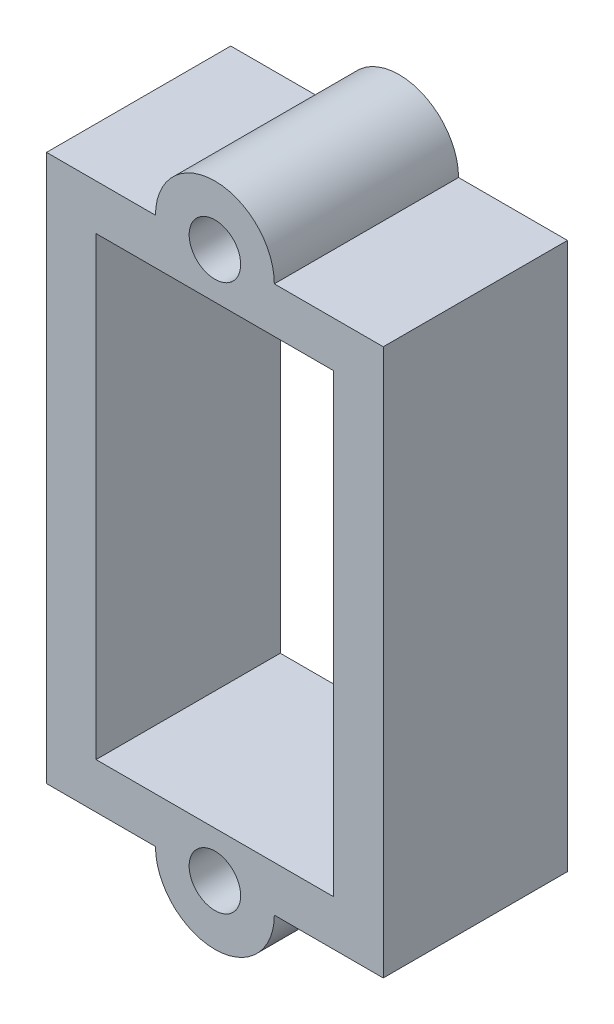
ISO-10303-21;
HEADER;
FILE_DESCRIPTION(('STEP AP214'),'2;1');
FILE_NAME('part.step','',(''),(''),'','','');
FILE_SCHEMA(('AUTOMOTIVE_DESIGN { 1 0 10303 214 1 1 1 1 }'));
ENDSEC;
DATA;
#1=APPLICATION_CONTEXT('core data for automotive mechanical design processes');
#2=APPLICATION_PROTOCOL_DEFINITION('international standard','automotive_design',2000,#1);
#3=PRODUCT_CONTEXT('',#1,'mechanical');
#4=PRODUCT('Part','Part','',(#3));
#5=PRODUCT_RELATED_PRODUCT_CATEGORY('part','',(#4));
#6=PRODUCT_DEFINITION_FORMATION('','',#4);
#7=PRODUCT_DEFINITION_CONTEXT('part definition',#1,'design');
#8=PRODUCT_DEFINITION('design','',#6,#7);
#9=PRODUCT_DEFINITION_SHAPE('','',#8);
#10=(LENGTH_UNIT() NAMED_UNIT(*) SI_UNIT(.MILLI.,.METRE.));
#11=(NAMED_UNIT(*) PLANE_ANGLE_UNIT() SI_UNIT($,.RADIAN.));
#12=(NAMED_UNIT(*) SI_UNIT($,.STERADIAN.) SOLID_ANGLE_UNIT());
#13=UNCERTAINTY_MEASURE_WITH_UNIT(LENGTH_MEASURE(1.E-05),#10,'distance_accuracy_value','');
#14=(GEOMETRIC_REPRESENTATION_CONTEXT(3) GLOBAL_UNCERTAINTY_ASSIGNED_CONTEXT((#13)) GLOBAL_UNIT_ASSIGNED_CONTEXT((#10,
#11,#12)) REPRESENTATION_CONTEXT('',''));
#15=CARTESIAN_POINT('',(0.,0.,0.));
#16=DIRECTION('',(0.,0.,1.));
#17=DIRECTION('',(1.,0.,0.));
#18=AXIS2_PLACEMENT_3D('',#15,#16,#17);
#19=CARTESIAN_POINT('',(0.,-13.8,9.3));
#20=DIRECTION('',(0.,0.,1.));
#21=DIRECTION('',(1.,0.,0.));
#22=AXIS2_PLACEMENT_3D('',#19,#20,#21);
#23=PLANE('',#22);
#24=CARTESIAN_POINT('',(0.,13.8,9.3));
#25=DIRECTION('',(0.,0.,1.));
#26=DIRECTION('',(1.,0.,0.));
#27=AXIS2_PLACEMENT_3D('',#24,#25,#26);
#28=CIRCLE('',#27,1.3);
#29=CARTESIAN_POINT('',(1.3,13.8,9.3));
#30=VERTEX_POINT('',#29);
#31=EDGE_CURVE('E170',#30,#30,#28,.T.);
#32=ORIENTED_EDGE('',*,*,#31,.F.);
#33=EDGE_LOOP('',(#32));
#34=FACE_BOUND('',#33,.T.);
#35=CARTESIAN_POINT('',(0.,-13.8,9.3));
#36=DIRECTION('',(0.,0.,1.));
#37=DIRECTION('',(1.,0.,0.));
#38=AXIS2_PLACEMENT_3D('',#35,#36,#37);
#39=CIRCLE('',#38,2.99999999999999);
#40=CARTESIAN_POINT('',(-2.99999999999999,-13.8,9.3));
#41=VERTEX_POINT('',#40);
#42=CARTESIAN_POINT('',(2.99999999999999,-13.8,9.3));
#43=VERTEX_POINT('',#42);
#44=EDGE_CURVE('E186',#41,#43,#39,.T.);
#45=ORIENTED_EDGE('',*,*,#44,.T.);
#46=DIRECTION('',(1.,0.,0.));
#47=VECTOR('',#46,1.);
#48=CARTESIAN_POINT('',(8.50000000000001,-13.8,9.3));
#49=LINE('',#48,#47);
#50=CARTESIAN_POINT('',(8.50000000000001,-13.8,9.3));
#51=VERTEX_POINT('',#50);
#52=EDGE_CURVE('E190',#43,#51,#49,.T.);
#53=ORIENTED_EDGE('',*,*,#52,.T.);
#54=DIRECTION('',(0.,1.,0.));
#55=VECTOR('',#54,1.);
#56=CARTESIAN_POINT('',(8.5,13.8,9.3));
#57=LINE('',#56,#55);
#58=CARTESIAN_POINT('',(8.5,13.8,9.3));
#59=VERTEX_POINT('',#58);
#60=EDGE_CURVE('E194',#51,#59,#57,.T.);
#61=ORIENTED_EDGE('',*,*,#60,.T.);
#62=DIRECTION('',(-1.,0.,0.));
#63=VECTOR('',#62,1.);
#64=CARTESIAN_POINT('',(2.99999999999999,13.8,9.3));
#65=LINE('',#64,#63);
#66=CARTESIAN_POINT('',(2.99999999999999,13.8,9.3));
#67=VERTEX_POINT('',#66);
#68=EDGE_CURVE('E197',#59,#67,#65,.T.);
#69=ORIENTED_EDGE('',*,*,#68,.T.);
#70=CARTESIAN_POINT('',(0.,13.8,9.3));
#71=DIRECTION('',(0.,0.,1.));
#72=DIRECTION('',(-1.,0.,0.));
#73=AXIS2_PLACEMENT_3D('',#70,#71,#72);
#74=CIRCLE('',#73,2.99999999999999);
#75=CARTESIAN_POINT('',(-2.99999999999999,13.8,9.3));
#76=VERTEX_POINT('',#75);
#77=EDGE_CURVE('E200',#67,#76,#74,.T.);
#78=ORIENTED_EDGE('',*,*,#77,.T.);
#79=DIRECTION('',(-1.,0.,0.));
#80=VECTOR('',#79,1.);
#81=CARTESIAN_POINT('',(-2.99999999999999,13.8,9.3));
#82=LINE('',#81,#80);
#83=CARTESIAN_POINT('',(-8.50000000000001,13.8,9.3));
#84=VERTEX_POINT('',#83);
#85=EDGE_CURVE('E203',#76,#84,#82,.T.);
#86=ORIENTED_EDGE('',*,*,#85,.T.);
#87=DIRECTION('',(0.,-1.,0.));
#88=VECTOR('',#87,1.);
#89=CARTESIAN_POINT('',(-8.50000000000001,13.8,9.3));
#90=LINE('',#89,#88);
#91=CARTESIAN_POINT('',(-8.5,-13.8,9.3));
#92=VERTEX_POINT('',#91);
#93=EDGE_CURVE('E206',#84,#92,#90,.T.);
#94=ORIENTED_EDGE('',*,*,#93,.T.);
#95=DIRECTION('',(1.,0.,0.));
#96=VECTOR('',#95,1.);
#97=CARTESIAN_POINT('',(-8.5,-13.8,9.3));
#98=LINE('',#97,#96);
#99=EDGE_CURVE('E209',#92,#41,#98,.T.);
#100=ORIENTED_EDGE('',*,*,#99,.T.);
#101=EDGE_LOOP('',(#45,#53,#61,#69,#78,#86,#94,#100));
#102=FACE_BOUND('',#101,.T.);
#103=DIRECTION('',(-1.,0.,0.));
#104=VECTOR('',#103,1.);
#105=CARTESIAN_POINT('',(-6.,11.5,9.3));
#106=LINE('',#105,#104);
#107=CARTESIAN_POINT('',(6.,11.5,9.3));
#108=VERTEX_POINT('',#107);
#109=CARTESIAN_POINT('',(-6.,11.5,9.3));
#110=VERTEX_POINT('',#109);
#111=EDGE_CURVE('E144',#108,#110,#106,.T.);
#112=ORIENTED_EDGE('',*,*,#111,.F.);
#113=DIRECTION('',(0.,1.,0.));
#114=VECTOR('',#113,1.);
#115=CARTESIAN_POINT('',(6.,11.5,9.3));
#116=LINE('',#115,#114);
#117=CARTESIAN_POINT('',(6.,-11.5,9.3));
#118=VERTEX_POINT('',#117);
#119=EDGE_CURVE('E135',#118,#108,#116,.T.);
#120=ORIENTED_EDGE('',*,*,#119,.F.);
#121=DIRECTION('',(1.,0.,0.));
#122=VECTOR('',#121,1.);
#123=CARTESIAN_POINT('',(-5.99999999999999,-11.5,9.3));
#124=LINE('',#123,#122);
#125=CARTESIAN_POINT('',(-5.99999999999999,-11.5,9.3));
#126=VERTEX_POINT('',#125);
#127=EDGE_CURVE('E162',#126,#118,#124,.T.);
#128=ORIENTED_EDGE('',*,*,#127,.F.);
#129=DIRECTION('',(0.,-1.,0.));
#130=VECTOR('',#129,1.);
#131=CARTESIAN_POINT('',(-6.,11.5,9.3));
#132=LINE('',#131,#130);
#133=EDGE_CURVE('E158',#110,#126,#132,.T.);
#134=ORIENTED_EDGE('',*,*,#133,.F.);
#135=EDGE_LOOP('',(#112,#120,#128,#134));
#136=FACE_BOUND('',#135,.T.);
#137=CARTESIAN_POINT('',(0.,-13.8,9.3));
#138=DIRECTION('',(0.,0.,1.));
#139=DIRECTION('',(1.,0.,0.));
#140=AXIS2_PLACEMENT_3D('',#137,#138,#139);
#141=CIRCLE('',#140,1.3);
#142=CARTESIAN_POINT('',(1.30000000000001,-13.8,9.3));
#143=VERTEX_POINT('',#142);
#144=EDGE_CURVE('E349',#143,#143,#141,.T.);
#145=ORIENTED_EDGE('',*,*,#144,.F.);
#146=EDGE_LOOP('',(#145));
#147=FACE_BOUND('',#146,.T.);
#148=ADVANCED_FACE('F45',(#34,#102,#136,#147),#23,.T.);
#149=CARTESIAN_POINT('',(0.,-13.8,0.));
#150=DIRECTION('',(0.,0.,1.));
#151=DIRECTION('',(1.,0.,0.));
#152=AXIS2_PLACEMENT_3D('',#149,#150,#151);
#153=PLANE('',#152);
#154=CARTESIAN_POINT('',(0.,-13.8,0.));
#155=DIRECTION('',(0.,0.,1.));
#156=DIRECTION('',(1.,0.,0.));
#157=AXIS2_PLACEMENT_3D('',#154,#155,#156);
#158=CIRCLE('',#157,2.99999999999999);
#159=CARTESIAN_POINT('',(-2.99999999999999,-13.8,0.));
#160=VERTEX_POINT('',#159);
#161=CARTESIAN_POINT('',(2.99999999999999,-13.8,0.));
#162=VERTEX_POINT('',#161);
#163=EDGE_CURVE('E153',#160,#162,#158,.T.);
#164=ORIENTED_EDGE('',*,*,#163,.F.);
#165=DIRECTION('',(1.,0.,0.));
#166=VECTOR('',#165,1.);
#167=CARTESIAN_POINT('',(-8.5,-13.8,0.));
#168=LINE('',#167,#166);
#169=CARTESIAN_POINT('',(-8.5,-13.8,0.));
#170=VERTEX_POINT('',#169);
#171=EDGE_CURVE('E191',#170,#160,#168,.T.);
#172=ORIENTED_EDGE('',*,*,#171,.F.);
#173=DIRECTION('',(0.,-1.,0.));
#174=VECTOR('',#173,1.);
#175=CARTESIAN_POINT('',(-8.50000000000001,13.8,0.));
#176=LINE('',#175,#174);
#177=CARTESIAN_POINT('',(-8.50000000000001,13.8,0.));
#178=VERTEX_POINT('',#177);
#179=EDGE_CURVE('E231',#178,#170,#176,.T.);
#180=ORIENTED_EDGE('',*,*,#179,.F.);
#181=DIRECTION('',(-1.,0.,0.));
#182=VECTOR('',#181,1.);
#183=CARTESIAN_POINT('',(-2.99999999999999,13.8,0.));
#184=LINE('',#183,#182);
#185=CARTESIAN_POINT('',(-2.99999999999999,13.8,0.));
#186=VERTEX_POINT('',#185);
#187=EDGE_CURVE('E228',#186,#178,#184,.T.);
#188=ORIENTED_EDGE('',*,*,#187,.F.);
#189=CARTESIAN_POINT('',(0.,13.8,0.));
#190=DIRECTION('',(0.,0.,1.));
#191=DIRECTION('',(-1.,0.,0.));
#192=AXIS2_PLACEMENT_3D('',#189,#190,#191);
#193=CIRCLE('',#192,2.99999999999999);
#194=CARTESIAN_POINT('',(2.99999999999999,13.8,0.));
#195=VERTEX_POINT('',#194);
#196=EDGE_CURVE('E225',#195,#186,#193,.T.);
#197=ORIENTED_EDGE('',*,*,#196,.F.);
#198=DIRECTION('',(-1.,0.,0.));
#199=VECTOR('',#198,1.);
#200=CARTESIAN_POINT('',(2.99999999999999,13.8,0.));
#201=LINE('',#200,#199);
#202=CARTESIAN_POINT('',(8.5,13.8,0.));
#203=VERTEX_POINT('',#202);
#204=EDGE_CURVE('E222',#203,#195,#201,.T.);
#205=ORIENTED_EDGE('',*,*,#204,.F.);
#206=DIRECTION('',(0.,1.,0.));
#207=VECTOR('',#206,1.);
#208=CARTESIAN_POINT('',(8.5,13.8,0.));
#209=LINE('',#208,#207);
#210=CARTESIAN_POINT('',(8.50000000000001,-13.8,0.));
#211=VERTEX_POINT('',#210);
#212=EDGE_CURVE('E219',#211,#203,#209,.T.);
#213=ORIENTED_EDGE('',*,*,#212,.F.);
#214=DIRECTION('',(1.,0.,0.));
#215=VECTOR('',#214,1.);
#216=CARTESIAN_POINT('',(8.50000000000001,-13.8,0.));
#217=LINE('',#216,#215);
#218=EDGE_CURVE('E216',#162,#211,#217,.T.);
#219=ORIENTED_EDGE('',*,*,#218,.F.);
#220=EDGE_LOOP('',(#164,#172,#180,#188,#197,#205,#213,#219));
#221=FACE_BOUND('',#220,.T.);
#222=DIRECTION('',(0.,1.,0.));
#223=VECTOR('',#222,1.);
#224=CARTESIAN_POINT('',(6.,11.5,0.));
#225=LINE('',#224,#223);
#226=CARTESIAN_POINT('',(6.,-11.5,0.));
#227=VERTEX_POINT('',#226);
#228=CARTESIAN_POINT('',(6.,11.5,0.));
#229=VERTEX_POINT('',#228);
#230=EDGE_CURVE('E69',#227,#229,#225,.T.);
#231=ORIENTED_EDGE('',*,*,#230,.T.);
#232=DIRECTION('',(-1.,0.,0.));
#233=VECTOR('',#232,1.);
#234=CARTESIAN_POINT('',(-6.,11.5,0.));
#235=LINE('',#234,#233);
#236=CARTESIAN_POINT('',(-6.,11.5,0.));
#237=VERTEX_POINT('',#236);
#238=EDGE_CURVE('E151',#229,#237,#235,.T.);
#239=ORIENTED_EDGE('',*,*,#238,.T.);
#240=DIRECTION('',(0.,-1.,0.));
#241=VECTOR('',#240,1.);
#242=CARTESIAN_POINT('',(-6.,11.5,0.));
#243=LINE('',#242,#241);
#244=CARTESIAN_POINT('',(-5.99999999999999,-11.5,0.));
#245=VERTEX_POINT('',#244);
#246=EDGE_CURVE('E173',#237,#245,#243,.T.);
#247=ORIENTED_EDGE('',*,*,#246,.T.);
#248=DIRECTION('',(1.,0.,0.));
#249=VECTOR('',#248,1.);
#250=CARTESIAN_POINT('',(-5.99999999999999,-11.5,0.));
#251=LINE('',#250,#249);
#252=EDGE_CURVE('E145',#245,#227,#251,.T.);
#253=ORIENTED_EDGE('',*,*,#252,.T.);
#254=EDGE_LOOP('',(#231,#239,#247,#253));
#255=FACE_BOUND('',#254,.T.);
#256=CARTESIAN_POINT('',(0.,13.8,0.));
#257=DIRECTION('',(0.,0.,1.));
#258=DIRECTION('',(1.,0.,0.));
#259=AXIS2_PLACEMENT_3D('',#256,#257,#258);
#260=CIRCLE('',#259,1.3);
#261=CARTESIAN_POINT('',(1.3,13.8,0.));
#262=VERTEX_POINT('',#261);
#263=EDGE_CURVE('E357',#262,#262,#260,.T.);
#264=ORIENTED_EDGE('',*,*,#263,.T.);
#265=EDGE_LOOP('',(#264));
#266=FACE_BOUND('',#265,.T.);
#267=CARTESIAN_POINT('',(0.,-13.8,0.));
#268=DIRECTION('',(0.,0.,1.));
#269=DIRECTION('',(1.,0.,0.));
#270=AXIS2_PLACEMENT_3D('',#267,#268,#269);
#271=CIRCLE('',#270,1.3);
#272=CARTESIAN_POINT('',(1.30000000000001,-13.8,0.));
#273=VERTEX_POINT('',#272);
#274=EDGE_CURVE('E352',#273,#273,#271,.T.);
#275=ORIENTED_EDGE('',*,*,#274,.T.);
#276=EDGE_LOOP('',(#275));
#277=FACE_BOUND('',#276,.T.);
#278=ADVANCED_FACE('F270',(#221,#255,#266,#277),#153,.F.);
#279=CARTESIAN_POINT('',(0.,-13.8,9.3));
#280=DIRECTION('',(0.,0.,-1.));
#281=DIRECTION('',(-1.,0.,0.));
#282=AXIS2_PLACEMENT_3D('',#279,#280,#281);
#283=CYLINDRICAL_SURFACE('',#282,2.99999999999999);
#284=ORIENTED_EDGE('',*,*,#163,.T.);
#285=DIRECTION('',(0.,0.,-1.));
#286=VECTOR('',#285,1.);
#287=CARTESIAN_POINT('',(2.99999999999999,-13.8,9.3));
#288=LINE('',#287,#286);
#289=EDGE_CURVE('E11',#43,#162,#288,.T.);
#290=ORIENTED_EDGE('',*,*,#289,.F.);
#291=ORIENTED_EDGE('',*,*,#44,.F.);
#292=DIRECTION('',(0.,0.,-1.));
#293=VECTOR('',#292,1.);
#294=CARTESIAN_POINT('',(-2.99999999999999,-13.8,9.3));
#295=LINE('',#294,#293);
#296=EDGE_CURVE('E212',#41,#160,#295,.T.);
#297=ORIENTED_EDGE('',*,*,#296,.T.);
#298=EDGE_LOOP('',(#284,#290,#291,#297));
#299=FACE_BOUND('',#298,.T.);
#300=ADVANCED_FACE('F47',(#299),#283,.T.);
#301=CARTESIAN_POINT('',(8.50000000000001,-13.8,9.3));
#302=DIRECTION('',(0.,1.,0.));
#303=DIRECTION('',(-1.,0.,0.));
#304=AXIS2_PLACEMENT_3D('',#301,#302,#303);
#305=PLANE('',#304);
#306=ORIENTED_EDGE('',*,*,#218,.T.);
#307=DIRECTION('',(0.,0.,-1.));
#308=VECTOR('',#307,1.);
#309=CARTESIAN_POINT('',(8.50000000000001,-13.8,9.3));
#310=LINE('',#309,#308);
#311=EDGE_CURVE('E54',#51,#211,#310,.T.);
#312=ORIENTED_EDGE('',*,*,#311,.F.);
#313=ORIENTED_EDGE('',*,*,#52,.F.);
#314=ORIENTED_EDGE('',*,*,#289,.T.);
#315=EDGE_LOOP('',(#306,#312,#313,#314));
#316=FACE_BOUND('',#315,.T.);
#317=ADVANCED_FACE('F287',(#316),#305,.F.);
#318=CARTESIAN_POINT('',(8.5,13.8,9.3));
#319=DIRECTION('',(-1.,0.,0.));
#320=DIRECTION('',(0.,-1.,0.));
#321=AXIS2_PLACEMENT_3D('',#318,#319,#320);
#322=PLANE('',#321);
#323=ORIENTED_EDGE('',*,*,#212,.T.);
#324=DIRECTION('',(0.,0.,-1.));
#325=VECTOR('',#324,1.);
#326=CARTESIAN_POINT('',(8.5,13.8,9.3));
#327=LINE('',#326,#325);
#328=EDGE_CURVE('E255',#59,#203,#327,.T.);
#329=ORIENTED_EDGE('',*,*,#328,.F.);
#330=ORIENTED_EDGE('',*,*,#60,.F.);
#331=ORIENTED_EDGE('',*,*,#311,.T.);
#332=EDGE_LOOP('',(#323,#329,#330,#331));
#333=FACE_BOUND('',#332,.T.);
#334=ADVANCED_FACE('F264',(#333),#322,.F.);
#335=CARTESIAN_POINT('',(2.99999999999999,13.8,9.3));
#336=DIRECTION('',(0.,-1.,0.));
#337=DIRECTION('',(0.,0.,-1.));
#338=AXIS2_PLACEMENT_3D('',#335,#336,#337);
#339=PLANE('',#338);
#340=ORIENTED_EDGE('',*,*,#204,.T.);
#341=DIRECTION('',(0.,0.,-1.));
#342=VECTOR('',#341,1.);
#343=CARTESIAN_POINT('',(2.99999999999999,13.8,9.3));
#344=LINE('',#343,#342);
#345=EDGE_CURVE('E251',#67,#195,#344,.T.);
#346=ORIENTED_EDGE('',*,*,#345,.F.);
#347=ORIENTED_EDGE('',*,*,#68,.F.);
#348=ORIENTED_EDGE('',*,*,#328,.T.);
#349=EDGE_LOOP('',(#340,#346,#347,#348));
#350=FACE_BOUND('',#349,.T.);
#351=ADVANCED_FACE('F276',(#350),#339,.F.);
#352=CARTESIAN_POINT('',(0.,13.8,9.3));
#353=DIRECTION('',(0.,0.,-1.));
#354=DIRECTION('',(-1.,0.,0.));
#355=AXIS2_PLACEMENT_3D('',#352,#353,#354);
#356=CYLINDRICAL_SURFACE('',#355,2.99999999999999);
#357=ORIENTED_EDGE('',*,*,#196,.T.);
#358=DIRECTION('',(0.,0.,-1.));
#359=VECTOR('',#358,1.);
#360=CARTESIAN_POINT('',(-2.99999999999999,13.8,9.3));
#361=LINE('',#360,#359);
#362=EDGE_CURVE('E247',#76,#186,#361,.T.);
#363=ORIENTED_EDGE('',*,*,#362,.F.);
#364=ORIENTED_EDGE('',*,*,#77,.F.);
#365=ORIENTED_EDGE('',*,*,#345,.T.);
#366=EDGE_LOOP('',(#357,#363,#364,#365));
#367=FACE_BOUND('',#366,.T.);
#368=ADVANCED_FACE('F280',(#367),#356,.T.);
#369=CARTESIAN_POINT('',(-2.99999999999999,13.8,9.3));
#370=DIRECTION('',(0.,-1.,0.));
#371=DIRECTION('',(1.,0.,0.));
#372=AXIS2_PLACEMENT_3D('',#369,#370,#371);
#373=PLANE('',#372);
#374=ORIENTED_EDGE('',*,*,#187,.T.);
#375=DIRECTION('',(0.,0.,-1.));
#376=VECTOR('',#375,1.);
#377=CARTESIAN_POINT('',(-8.50000000000001,13.8,9.3));
#378=LINE('',#377,#376);
#379=EDGE_CURVE('E243',#84,#178,#378,.T.);
#380=ORIENTED_EDGE('',*,*,#379,.F.);
#381=ORIENTED_EDGE('',*,*,#85,.F.);
#382=ORIENTED_EDGE('',*,*,#362,.T.);
#383=EDGE_LOOP('',(#374,#380,#381,#382));
#384=FACE_BOUND('',#383,.T.);
#385=ADVANCED_FACE('F300',(#384),#373,.F.);
#386=CARTESIAN_POINT('',(-8.50000000000001,13.8,9.3));
#387=DIRECTION('',(1.,0.,0.));
#388=DIRECTION('',(0.,1.,0.));
#389=AXIS2_PLACEMENT_3D('',#386,#387,#388);
#390=PLANE('',#389);
#391=ORIENTED_EDGE('',*,*,#179,.T.);
#392=DIRECTION('',(0.,0.,-1.));
#393=VECTOR('',#392,1.);
#394=CARTESIAN_POINT('',(-8.5,-13.8,9.3));
#395=LINE('',#394,#393);
#396=EDGE_CURVE('E239',#92,#170,#395,.T.);
#397=ORIENTED_EDGE('',*,*,#396,.F.);
#398=ORIENTED_EDGE('',*,*,#93,.F.);
#399=ORIENTED_EDGE('',*,*,#379,.T.);
#400=EDGE_LOOP('',(#391,#397,#398,#399));
#401=FACE_BOUND('',#400,.T.);
#402=ADVANCED_FACE('F298',(#401),#390,.F.);
#403=CARTESIAN_POINT('',(-8.5,-13.8,9.3));
#404=DIRECTION('',(0.,1.,0.));
#405=DIRECTION('',(-1.,0.,0.));
#406=AXIS2_PLACEMENT_3D('',#403,#404,#405);
#407=PLANE('',#406);
#408=ORIENTED_EDGE('',*,*,#171,.T.);
#409=ORIENTED_EDGE('',*,*,#296,.F.);
#410=ORIENTED_EDGE('',*,*,#99,.F.);
#411=ORIENTED_EDGE('',*,*,#396,.T.);
#412=EDGE_LOOP('',(#408,#409,#410,#411));
#413=FACE_BOUND('',#412,.T.);
#414=ADVANCED_FACE('F293',(#413),#407,.F.);
#415=CARTESIAN_POINT('',(6.,11.5,9.3));
#416=DIRECTION('',(-1.,0.,0.));
#417=DIRECTION('',(0.,-1.,0.));
#418=AXIS2_PLACEMENT_3D('',#415,#416,#417);
#419=PLANE('',#418);
#420=ORIENTED_EDGE('',*,*,#230,.F.);
#421=DIRECTION('',(0.,0.,-1.));
#422=VECTOR('',#421,1.);
#423=CARTESIAN_POINT('',(6.,-11.5,9.3));
#424=LINE('',#423,#422);
#425=EDGE_CURVE('E139',#118,#227,#424,.T.);
#426=ORIENTED_EDGE('',*,*,#425,.F.);
#427=ORIENTED_EDGE('',*,*,#119,.T.);
#428=DIRECTION('',(0.,0.,-1.));
#429=VECTOR('',#428,1.);
#430=CARTESIAN_POINT('',(6.,11.5,9.3));
#431=LINE('',#430,#429);
#432=EDGE_CURVE('E138',#108,#229,#431,.T.);
#433=ORIENTED_EDGE('',*,*,#432,.T.);
#434=EDGE_LOOP('',(#420,#426,#427,#433));
#435=FACE_BOUND('',#434,.T.);
#436=ADVANCED_FACE('F137',(#435),#419,.T.);
#437=CARTESIAN_POINT('',(-6.,11.5,9.3));
#438=DIRECTION('',(0.,-1.,0.));
#439=DIRECTION('',(0.,0.,-1.));
#440=AXIS2_PLACEMENT_3D('',#437,#438,#439);
#441=PLANE('',#440);
#442=ORIENTED_EDGE('',*,*,#238,.F.);
#443=ORIENTED_EDGE('',*,*,#432,.F.);
#444=ORIENTED_EDGE('',*,*,#111,.T.);
#445=DIRECTION('',(0.,0.,-1.));
#446=VECTOR('',#445,1.);
#447=CARTESIAN_POINT('',(-6.,11.5,9.3));
#448=LINE('',#447,#446);
#449=EDGE_CURVE('E154',#110,#237,#448,.T.);
#450=ORIENTED_EDGE('',*,*,#449,.T.);
#451=EDGE_LOOP('',(#442,#443,#444,#450));
#452=FACE_BOUND('',#451,.T.);
#453=ADVANCED_FACE('F148',(#452),#441,.T.);
#454=CARTESIAN_POINT('',(-6.,11.5,9.3));
#455=DIRECTION('',(1.,0.,0.));
#456=DIRECTION('',(0.,1.,0.));
#457=AXIS2_PLACEMENT_3D('',#454,#455,#456);
#458=PLANE('',#457);
#459=ORIENTED_EDGE('',*,*,#246,.F.);
#460=ORIENTED_EDGE('',*,*,#449,.F.);
#461=ORIENTED_EDGE('',*,*,#133,.T.);
#462=DIRECTION('',(0.,0.,-1.));
#463=VECTOR('',#462,1.);
#464=CARTESIAN_POINT('',(-5.99999999999999,-11.5,9.3));
#465=LINE('',#464,#463);
#466=EDGE_CURVE('E61',#126,#245,#465,.T.);
#467=ORIENTED_EDGE('',*,*,#466,.T.);
#468=EDGE_LOOP('',(#459,#460,#461,#467));
#469=FACE_BOUND('',#468,.T.);
#470=ADVANCED_FACE('F327',(#469),#458,.T.);
#471=CARTESIAN_POINT('',(-5.99999999999999,-11.5,9.3));
#472=DIRECTION('',(0.,1.,0.));
#473=DIRECTION('',(-1.,0.,0.));
#474=AXIS2_PLACEMENT_3D('',#471,#472,#473);
#475=PLANE('',#474);
#476=ORIENTED_EDGE('',*,*,#252,.F.);
#477=ORIENTED_EDGE('',*,*,#466,.F.);
#478=ORIENTED_EDGE('',*,*,#127,.T.);
#479=ORIENTED_EDGE('',*,*,#425,.T.);
#480=EDGE_LOOP('',(#476,#477,#478,#479));
#481=FACE_BOUND('',#480,.T.);
#482=ADVANCED_FACE('F331',(#481),#475,.T.);
#483=CARTESIAN_POINT('',(0.,13.8,9.3));
#484=DIRECTION('',(0.,0.,-1.));
#485=DIRECTION('',(-1.,0.,0.));
#486=AXIS2_PLACEMENT_3D('',#483,#484,#485);
#487=CYLINDRICAL_SURFACE('',#486,1.3);
#488=ORIENTED_EDGE('',*,*,#31,.T.);
#489=EDGE_LOOP('',(#488));
#490=FACE_BOUND('',#489,.T.);
#491=ORIENTED_EDGE('',*,*,#263,.F.);
#492=EDGE_LOOP('',(#491));
#493=FACE_BOUND('',#492,.T.);
#494=ADVANCED_FACE('F337',(#490,#493),#487,.F.);
#495=CARTESIAN_POINT('',(0.,-13.8,9.3));
#496=DIRECTION('',(0.,0.,-1.));
#497=DIRECTION('',(-1.,0.,0.));
#498=AXIS2_PLACEMENT_3D('',#495,#496,#497);
#499=CYLINDRICAL_SURFACE('',#498,1.3);
#500=ORIENTED_EDGE('',*,*,#144,.T.);
#501=EDGE_LOOP('',(#500));
#502=FACE_BOUND('',#501,.T.);
#503=ORIENTED_EDGE('',*,*,#274,.F.);
#504=EDGE_LOOP('',(#503));
#505=FACE_BOUND('',#504,.T.);
#506=ADVANCED_FACE('F340',(#502,#505),#499,.F.);
#507=CLOSED_SHELL('',(#148,#278,#300,#317,#334,#351,#368,#385,#402,#414,#436,#453,#470,#482,
#494,#506));
#508=MANIFOLD_SOLID_BREP('B2',#507);
#509=ADVANCED_BREP_SHAPE_REPRESENTATION('',(#18,#508),#14);
#510=SHAPE_DEFINITION_REPRESENTATION(#9,#509);
ENDSEC;
END-ISO-10303-21;
